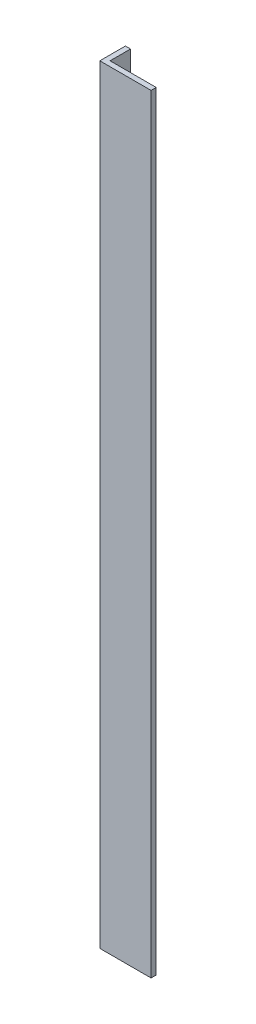
ISO-10303-21;
HEADER;
FILE_DESCRIPTION(('STEP AP214'),'2;1');
FILE_NAME('part.step','',(''),(''),'','','');
FILE_SCHEMA(('AUTOMOTIVE_DESIGN { 1 0 10303 214 1 1 1 1 }'));
ENDSEC;
DATA;
#1=APPLICATION_CONTEXT('core data for automotive mechanical design processes');
#2=APPLICATION_PROTOCOL_DEFINITION('international standard','automotive_design',2000,#1);
#3=PRODUCT_CONTEXT('',#1,'mechanical');
#4=PRODUCT('Part','Part','',(#3));
#5=PRODUCT_RELATED_PRODUCT_CATEGORY('part','',(#4));
#6=PRODUCT_DEFINITION_FORMATION('','',#4);
#7=PRODUCT_DEFINITION_CONTEXT('part definition',#1,'design');
#8=PRODUCT_DEFINITION('design','',#6,#7);
#9=PRODUCT_DEFINITION_SHAPE('','',#8);
#10=(LENGTH_UNIT() NAMED_UNIT(*) SI_UNIT(.MILLI.,.METRE.));
#11=(NAMED_UNIT(*) PLANE_ANGLE_UNIT() SI_UNIT($,.RADIAN.));
#12=(NAMED_UNIT(*) SI_UNIT($,.STERADIAN.) SOLID_ANGLE_UNIT());
#13=UNCERTAINTY_MEASURE_WITH_UNIT(LENGTH_MEASURE(1.E-05),#10,'distance_accuracy_value','');
#14=(GEOMETRIC_REPRESENTATION_CONTEXT(3) GLOBAL_UNCERTAINTY_ASSIGNED_CONTEXT((#13)) GLOBAL_UNIT_ASSIGNED_CONTEXT((#10,
#11,#12)) REPRESENTATION_CONTEXT('',''));
#15=CARTESIAN_POINT('',(0.,0.,0.));
#16=DIRECTION('',(0.,0.,1.));
#17=DIRECTION('',(1.,0.,0.));
#18=AXIS2_PLACEMENT_3D('',#15,#16,#17);
#19=CARTESIAN_POINT('',(20.,300.,0.));
#20=DIRECTION('',(0.,0.,-1.));
#21=DIRECTION('',(-1.,0.,0.));
#22=AXIS2_PLACEMENT_3D('',#19,#20,#21);
#23=PLANE('',#22);
#24=DIRECTION('',(1.,0.,0.));
#25=VECTOR('',#24,1.);
#26=CARTESIAN_POINT('',(20.,0.,0.));
#27=LINE('',#26,#25);
#28=CARTESIAN_POINT('',(0.,0.,0.));
#29=VERTEX_POINT('',#28);
#30=CARTESIAN_POINT('',(20.,0.,0.));
#31=VERTEX_POINT('',#30);
#32=EDGE_CURVE('E117',#29,#31,#27,.T.);
#33=ORIENTED_EDGE('',*,*,#32,.T.);
#34=DIRECTION('',(0.,-1.,0.));
#35=VECTOR('',#34,1.);
#36=CARTESIAN_POINT('',(20.,300.,0.));
#37=LINE('',#36,#35);
#38=CARTESIAN_POINT('',(20.,300.,0.));
#39=VERTEX_POINT('',#38);
#40=EDGE_CURVE('E11',#39,#31,#37,.T.);
#41=ORIENTED_EDGE('',*,*,#40,.F.);
#42=DIRECTION('',(1.,0.,0.));
#43=VECTOR('',#42,1.);
#44=CARTESIAN_POINT('',(20.,300.,0.));
#45=LINE('',#44,#43);
#46=CARTESIAN_POINT('',(0.,300.,0.));
#47=VERTEX_POINT('',#46);
#48=EDGE_CURVE('E127',#47,#39,#45,.T.);
#49=ORIENTED_EDGE('',*,*,#48,.F.);
#50=DIRECTION('',(0.,-1.,0.));
#51=VECTOR('',#50,1.);
#52=CARTESIAN_POINT('',(0.,300.,0.));
#53=LINE('',#52,#51);
#54=EDGE_CURVE('E113',#47,#29,#53,.T.);
#55=ORIENTED_EDGE('',*,*,#54,.T.);
#56=EDGE_LOOP('',(#33,#41,#49,#55));
#57=FACE_BOUND('',#56,.T.);
#58=ADVANCED_FACE('F33',(#57),#23,.F.);
#59=CARTESIAN_POINT('',(20.,300.,-2.));
#60=DIRECTION('',(-1.,0.,0.));
#61=DIRECTION('',(0.,0.,1.));
#62=AXIS2_PLACEMENT_3D('',#59,#60,#61);
#63=PLANE('',#62);
#64=DIRECTION('',(0.,0.,-1.));
#65=VECTOR('',#64,1.);
#66=CARTESIAN_POINT('',(20.,0.,-2.));
#67=LINE('',#66,#65);
#68=CARTESIAN_POINT('',(20.,0.,-2.));
#69=VERTEX_POINT('',#68);
#70=EDGE_CURVE('E120',#31,#69,#67,.T.);
#71=ORIENTED_EDGE('',*,*,#70,.T.);
#72=DIRECTION('',(0.,-1.,0.));
#73=VECTOR('',#72,1.);
#74=CARTESIAN_POINT('',(20.,300.,-2.));
#75=LINE('',#74,#73);
#76=CARTESIAN_POINT('',(20.,300.,-2.));
#77=VERTEX_POINT('',#76);
#78=EDGE_CURVE('E41',#77,#69,#75,.T.);
#79=ORIENTED_EDGE('',*,*,#78,.F.);
#80=DIRECTION('',(0.,0.,-1.));
#81=VECTOR('',#80,1.);
#82=CARTESIAN_POINT('',(20.,300.,-2.));
#83=LINE('',#82,#81);
#84=EDGE_CURVE('E86',#39,#77,#83,.T.);
#85=ORIENTED_EDGE('',*,*,#84,.F.);
#86=ORIENTED_EDGE('',*,*,#40,.T.);
#87=EDGE_LOOP('',(#71,#79,#85,#86));
#88=FACE_BOUND('',#87,.T.);
#89=ADVANCED_FACE('F151',(#88),#63,.F.);
#90=CARTESIAN_POINT('',(2.,300.,-2.));
#91=DIRECTION('',(0.,0.,1.));
#92=DIRECTION('',(1.,0.,0.));
#93=AXIS2_PLACEMENT_3D('',#90,#91,#92);
#94=PLANE('',#93);
#95=DIRECTION('',(-1.,0.,0.));
#96=VECTOR('',#95,1.);
#97=CARTESIAN_POINT('',(2.,0.,-2.));
#98=LINE('',#97,#96);
#99=CARTESIAN_POINT('',(2.,0.,-2.));
#100=VERTEX_POINT('',#99);
#101=EDGE_CURVE('E122',#69,#100,#98,.T.);
#102=ORIENTED_EDGE('',*,*,#101,.T.);
#103=DIRECTION('',(0.,-1.,0.));
#104=VECTOR('',#103,1.);
#105=CARTESIAN_POINT('',(2.,300.,-2.));
#106=LINE('',#105,#104);
#107=CARTESIAN_POINT('',(2.,300.,-2.));
#108=VERTEX_POINT('',#107);
#109=EDGE_CURVE('E108',#108,#100,#106,.T.);
#110=ORIENTED_EDGE('',*,*,#109,.F.);
#111=DIRECTION('',(-1.,0.,0.));
#112=VECTOR('',#111,1.);
#113=CARTESIAN_POINT('',(2.,300.,-2.));
#114=LINE('',#113,#112);
#115=EDGE_CURVE('E99',#77,#108,#114,.T.);
#116=ORIENTED_EDGE('',*,*,#115,.F.);
#117=ORIENTED_EDGE('',*,*,#78,.T.);
#118=EDGE_LOOP('',(#102,#110,#116,#117));
#119=FACE_BOUND('',#118,.T.);
#120=ADVANCED_FACE('F133',(#119),#94,.F.);
#121=CARTESIAN_POINT('',(2.,300.,-10.));
#122=DIRECTION('',(-1.,0.,0.));
#123=DIRECTION('',(0.,0.,1.));
#124=AXIS2_PLACEMENT_3D('',#121,#122,#123);
#125=PLANE('',#124);
#126=DIRECTION('',(0.,0.,-1.));
#127=VECTOR('',#126,1.);
#128=CARTESIAN_POINT('',(2.,0.,-10.));
#129=LINE('',#128,#127);
#130=CARTESIAN_POINT('',(2.,0.,-10.));
#131=VERTEX_POINT('',#130);
#132=EDGE_CURVE('E107',#100,#131,#129,.T.);
#133=ORIENTED_EDGE('',*,*,#132,.T.);
#134=DIRECTION('',(0.,-1.,0.));
#135=VECTOR('',#134,1.);
#136=CARTESIAN_POINT('',(2.,300.,-10.));
#137=LINE('',#136,#135);
#138=CARTESIAN_POINT('',(2.,300.,-10.));
#139=VERTEX_POINT('',#138);
#140=EDGE_CURVE('E104',#139,#131,#137,.T.);
#141=ORIENTED_EDGE('',*,*,#140,.F.);
#142=DIRECTION('',(0.,0.,-1.));
#143=VECTOR('',#142,1.);
#144=CARTESIAN_POINT('',(2.,300.,-10.));
#145=LINE('',#144,#143);
#146=EDGE_CURVE('E93',#108,#139,#145,.T.);
#147=ORIENTED_EDGE('',*,*,#146,.F.);
#148=ORIENTED_EDGE('',*,*,#109,.T.);
#149=EDGE_LOOP('',(#133,#141,#147,#148));
#150=FACE_BOUND('',#149,.T.);
#151=ADVANCED_FACE('F105',(#150),#125,.F.);
#152=CARTESIAN_POINT('',(0.,300.,-10.));
#153=DIRECTION('',(0.,0.,1.));
#154=DIRECTION('',(1.,0.,0.));
#155=AXIS2_PLACEMENT_3D('',#152,#153,#154);
#156=PLANE('',#155);
#157=DIRECTION('',(-1.,0.,0.));
#158=VECTOR('',#157,1.);
#159=CARTESIAN_POINT('',(0.,0.,-10.));
#160=LINE('',#159,#158);
#161=CARTESIAN_POINT('',(0.,0.,-10.));
#162=VERTEX_POINT('',#161);
#163=EDGE_CURVE('E72',#131,#162,#160,.T.);
#164=ORIENTED_EDGE('',*,*,#163,.T.);
#165=DIRECTION('',(0.,-1.,0.));
#166=VECTOR('',#165,1.);
#167=CARTESIAN_POINT('',(0.,300.,-10.));
#168=LINE('',#167,#166);
#169=CARTESIAN_POINT('',(0.,300.,-10.));
#170=VERTEX_POINT('',#169);
#171=EDGE_CURVE('E109',#170,#162,#168,.T.);
#172=ORIENTED_EDGE('',*,*,#171,.F.);
#173=DIRECTION('',(-1.,0.,0.));
#174=VECTOR('',#173,1.);
#175=CARTESIAN_POINT('',(0.,300.,-10.));
#176=LINE('',#175,#174);
#177=EDGE_CURVE('E97',#139,#170,#176,.T.);
#178=ORIENTED_EDGE('',*,*,#177,.F.);
#179=ORIENTED_EDGE('',*,*,#140,.T.);
#180=EDGE_LOOP('',(#164,#172,#178,#179));
#181=FACE_BOUND('',#180,.T.);
#182=ADVANCED_FACE('F111',(#181),#156,.F.);
#183=CARTESIAN_POINT('',(0.,300.,0.));
#184=DIRECTION('',(1.,0.,0.));
#185=DIRECTION('',(0.,0.,-1.));
#186=AXIS2_PLACEMENT_3D('',#183,#184,#185);
#187=PLANE('',#186);
#188=DIRECTION('',(0.,0.,1.));
#189=VECTOR('',#188,1.);
#190=CARTESIAN_POINT('',(0.,0.,0.));
#191=LINE('',#190,#189);
#192=EDGE_CURVE('E78',#162,#29,#191,.T.);
#193=ORIENTED_EDGE('',*,*,#192,.T.);
#194=ORIENTED_EDGE('',*,*,#54,.F.);
#195=DIRECTION('',(0.,0.,1.));
#196=VECTOR('',#195,1.);
#197=CARTESIAN_POINT('',(0.,300.,0.));
#198=LINE('',#197,#196);
#199=EDGE_CURVE('E49',#170,#47,#198,.T.);
#200=ORIENTED_EDGE('',*,*,#199,.F.);
#201=ORIENTED_EDGE('',*,*,#171,.T.);
#202=EDGE_LOOP('',(#193,#194,#200,#201));
#203=FACE_BOUND('',#202,.T.);
#204=ADVANCED_FACE('F140',(#203),#187,.F.);
#205=CARTESIAN_POINT('',(0.,300.,0.));
#206=DIRECTION('',(0.,-1.,0.));
#207=DIRECTION('',(0.,0.,-1.));
#208=AXIS2_PLACEMENT_3D('',#205,#206,#207);
#209=PLANE('',#208);
#210=ORIENTED_EDGE('',*,*,#48,.T.);
#211=ORIENTED_EDGE('',*,*,#84,.T.);
#212=ORIENTED_EDGE('',*,*,#115,.T.);
#213=ORIENTED_EDGE('',*,*,#146,.T.);
#214=ORIENTED_EDGE('',*,*,#177,.T.);
#215=ORIENTED_EDGE('',*,*,#199,.T.);
#216=EDGE_LOOP('',(#210,#211,#212,#213,#214,#215));
#217=FACE_BOUND('',#216,.T.);
#218=ADVANCED_FACE('F95',(#217),#209,.F.);
#219=CARTESIAN_POINT('',(0.,0.,0.));
#220=DIRECTION('',(0.,-1.,0.));
#221=DIRECTION('',(0.,0.,-1.));
#222=AXIS2_PLACEMENT_3D('',#219,#220,#221);
#223=PLANE('',#222);
#224=ORIENTED_EDGE('',*,*,#32,.F.);
#225=ORIENTED_EDGE('',*,*,#192,.F.);
#226=ORIENTED_EDGE('',*,*,#163,.F.);
#227=ORIENTED_EDGE('',*,*,#132,.F.);
#228=ORIENTED_EDGE('',*,*,#101,.F.);
#229=ORIENTED_EDGE('',*,*,#70,.F.);
#230=EDGE_LOOP('',(#224,#225,#226,#227,#228,#229));
#231=FACE_BOUND('',#230,.T.);
#232=ADVANCED_FACE('F136',(#231),#223,.T.);
#233=CLOSED_SHELL('',(#58,#89,#120,#151,#182,#204,#218,#232));
#234=MANIFOLD_SOLID_BREP('B2',#233);
#235=ADVANCED_BREP_SHAPE_REPRESENTATION('',(#18,#234),#14);
#236=SHAPE_DEFINITION_REPRESENTATION(#9,#235);
ENDSEC;
END-ISO-10303-21;
